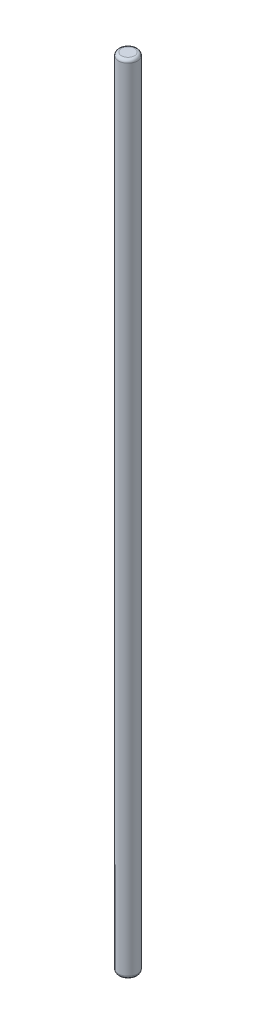
ISO-10303-21;
HEADER;
FILE_DESCRIPTION(('STEP AP214'),'2;1');
FILE_NAME('part.step','',(''),(''),'','','');
FILE_SCHEMA(('AUTOMOTIVE_DESIGN { 1 0 10303 214 1 1 1 1 }'));
ENDSEC;
DATA;
#1=APPLICATION_CONTEXT('core data for automotive mechanical design processes');
#2=APPLICATION_PROTOCOL_DEFINITION('international standard','automotive_design',2000,#1);
#3=PRODUCT_CONTEXT('',#1,'mechanical');
#4=PRODUCT('Part','Part','',(#3));
#5=PRODUCT_RELATED_PRODUCT_CATEGORY('part','',(#4));
#6=PRODUCT_DEFINITION_FORMATION('','',#4);
#7=PRODUCT_DEFINITION_CONTEXT('part definition',#1,'design');
#8=PRODUCT_DEFINITION('design','',#6,#7);
#9=PRODUCT_DEFINITION_SHAPE('','',#8);
#10=(LENGTH_UNIT() NAMED_UNIT(*) SI_UNIT(.MILLI.,.METRE.));
#11=(NAMED_UNIT(*) PLANE_ANGLE_UNIT() SI_UNIT($,.RADIAN.));
#12=(NAMED_UNIT(*) SI_UNIT($,.STERADIAN.) SOLID_ANGLE_UNIT());
#13=UNCERTAINTY_MEASURE_WITH_UNIT(LENGTH_MEASURE(1.E-05),#10,'distance_accuracy_value','');
#14=(GEOMETRIC_REPRESENTATION_CONTEXT(3) GLOBAL_UNCERTAINTY_ASSIGNED_CONTEXT((#13)) GLOBAL_UNIT_ASSIGNED_CONTEXT((#10,
#11,#12)) REPRESENTATION_CONTEXT('',''));
#15=CARTESIAN_POINT('',(0.,0.,0.));
#16=DIRECTION('',(0.,0.,1.));
#17=DIRECTION('',(1.,0.,0.));
#18=AXIS2_PLACEMENT_3D('',#15,#16,#17);
#19=CARTESIAN_POINT('',(0.,80.,0.));
#20=DIRECTION('',(0.,-1.,0.));
#21=DIRECTION('',(0.,0.,-1.));
#22=AXIS2_PLACEMENT_3D('',#19,#20,#21);
#23=CYLINDRICAL_SURFACE('',#22,0.95);
#24=CARTESIAN_POINT('',(0.,0.299999999999995,0.));
#25=DIRECTION('',(0.,1.,0.));
#26=DIRECTION('',(0.,0.,1.));
#27=AXIS2_PLACEMENT_3D('',#24,#25,#26);
#28=CIRCLE('',#27,0.95);
#29=CARTESIAN_POINT('',(0.,0.299999999999995,0.95));
#30=VERTEX_POINT('',#29);
#31=EDGE_CURVE('E50',#30,#30,#28,.T.);
#32=ORIENTED_EDGE('',*,*,#31,.T.);
#33=EDGE_LOOP('',(#32));
#34=FACE_BOUND('',#33,.T.);
#35=CARTESIAN_POINT('',(0.,79.7,0.));
#36=DIRECTION('',(0.,1.,0.));
#37=DIRECTION('',(0.,0.,1.));
#38=AXIS2_PLACEMENT_3D('',#35,#36,#37);
#39=CIRCLE('',#38,0.95);
#40=CARTESIAN_POINT('',(0.,79.7,0.95));
#41=VERTEX_POINT('',#40);
#42=EDGE_CURVE('E55',#41,#41,#39,.F.);
#43=ORIENTED_EDGE('',*,*,#42,.T.);
#44=EDGE_LOOP('',(#43));
#45=FACE_BOUND('',#44,.T.);
#46=ADVANCED_FACE('F37',(#34,#45),#23,.T.);
#47=CARTESIAN_POINT('',(0.,80.,0.));
#48=DIRECTION('',(0.,1.,0.));
#49=DIRECTION('',(0.,0.,1.));
#50=AXIS2_PLACEMENT_3D('',#47,#48,#49);
#51=PLANE('',#50);
#52=CARTESIAN_POINT('',(0.,80.,0.));
#53=DIRECTION('',(0.,1.,0.));
#54=DIRECTION('',(0.,0.,1.));
#55=AXIS2_PLACEMENT_3D('',#52,#53,#54);
#56=CIRCLE('',#55,0.65);
#57=CARTESIAN_POINT('',(0.,80.,0.65));
#58=VERTEX_POINT('',#57);
#59=EDGE_CURVE('E10',#58,#58,#56,.T.);
#60=ORIENTED_EDGE('',*,*,#59,.T.);
#61=EDGE_LOOP('',(#60));
#62=FACE_BOUND('',#61,.T.);
#63=ADVANCED_FACE('F72',(#62),#51,.T.);
#64=CARTESIAN_POINT('',(0.,0.,0.));
#65=DIRECTION('',(0.,1.,0.));
#66=DIRECTION('',(0.,0.,1.));
#67=AXIS2_PLACEMENT_3D('',#64,#65,#66);
#68=PLANE('',#67);
#69=CARTESIAN_POINT('',(0.,0.,0.));
#70=DIRECTION('',(0.,1.,0.));
#71=DIRECTION('',(0.,0.,1.));
#72=AXIS2_PLACEMENT_3D('',#69,#70,#71);
#73=CIRCLE('',#72,0.65);
#74=CARTESIAN_POINT('',(0.,0.,0.65));
#75=VERTEX_POINT('',#74);
#76=EDGE_CURVE('E45',#75,#75,#73,.F.);
#77=ORIENTED_EDGE('',*,*,#76,.T.);
#78=EDGE_LOOP('',(#77));
#79=FACE_BOUND('',#78,.T.);
#80=ADVANCED_FACE('F69',(#79),#68,.F.);
#81=CARTESIAN_POINT('',(0.,0.299999999999995,0.));
#82=DIRECTION('',(0.,1.,0.));
#83=DIRECTION('',(0.,0.,1.));
#84=AXIS2_PLACEMENT_3D('',#81,#82,#83);
#85=TOROIDAL_SURFACE('',#84,0.65,0.3);
#86=ORIENTED_EDGE('',*,*,#76,.F.);
#87=EDGE_LOOP('',(#86));
#88=FACE_BOUND('',#87,.T.);
#89=ORIENTED_EDGE('',*,*,#31,.F.);
#90=EDGE_LOOP('',(#89));
#91=FACE_BOUND('',#90,.T.);
#92=ADVANCED_FACE('F65',(#88,#91),#85,.T.);
#93=CARTESIAN_POINT('',(0.,79.7,0.));
#94=DIRECTION('',(0.,1.,0.));
#95=DIRECTION('',(0.,0.,1.));
#96=AXIS2_PLACEMENT_3D('',#93,#94,#95);
#97=TOROIDAL_SURFACE('',#96,0.65,0.3);
#98=ORIENTED_EDGE('',*,*,#42,.F.);
#99=EDGE_LOOP('',(#98));
#100=FACE_BOUND('',#99,.T.);
#101=ORIENTED_EDGE('',*,*,#59,.F.);
#102=EDGE_LOOP('',(#101));
#103=FACE_BOUND('',#102,.T.);
#104=ADVANCED_FACE('F39',(#100,#103),#97,.T.);
#105=CLOSED_SHELL('',(#46,#63,#80,#92,#104));
#106=MANIFOLD_SOLID_BREP('B2',#105);
#107=ADVANCED_BREP_SHAPE_REPRESENTATION('',(#18,#106),#14);
#108=SHAPE_DEFINITION_REPRESENTATION(#9,#107);
ENDSEC;
END-ISO-10303-21;
